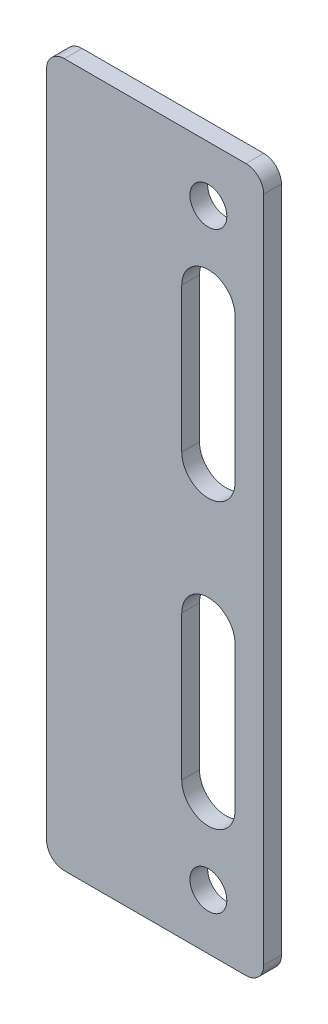
ISO-10303-21;
HEADER;
FILE_DESCRIPTION(('STEP AP214'),'2;1');
FILE_NAME('part.step','',(''),(''),'','','');
FILE_SCHEMA(('AUTOMOTIVE_DESIGN { 1 0 10303 214 1 1 1 1 }'));
ENDSEC;
DATA;
#1=APPLICATION_CONTEXT('core data for automotive mechanical design processes');
#2=APPLICATION_PROTOCOL_DEFINITION('international standard','automotive_design',2000,#1);
#3=PRODUCT_CONTEXT('',#1,'mechanical');
#4=PRODUCT('Part','Part','',(#3));
#5=PRODUCT_RELATED_PRODUCT_CATEGORY('part','',(#4));
#6=PRODUCT_DEFINITION_FORMATION('','',#4);
#7=PRODUCT_DEFINITION_CONTEXT('part definition',#1,'design');
#8=PRODUCT_DEFINITION('design','',#6,#7);
#9=PRODUCT_DEFINITION_SHAPE('','',#8);
#10=(LENGTH_UNIT() NAMED_UNIT(*) SI_UNIT(.MILLI.,.METRE.));
#11=(NAMED_UNIT(*) PLANE_ANGLE_UNIT() SI_UNIT($,.RADIAN.));
#12=(NAMED_UNIT(*) SI_UNIT($,.STERADIAN.) SOLID_ANGLE_UNIT());
#13=UNCERTAINTY_MEASURE_WITH_UNIT(LENGTH_MEASURE(1.E-05),#10,'distance_accuracy_value','');
#14=(GEOMETRIC_REPRESENTATION_CONTEXT(3) GLOBAL_UNCERTAINTY_ASSIGNED_CONTEXT((#13)) GLOBAL_UNIT_ASSIGNED_CONTEXT((#10,
#11,#12)) REPRESENTATION_CONTEXT('',''));
#15=CARTESIAN_POINT('',(0.,0.,0.));
#16=DIRECTION('',(0.,0.,1.));
#17=DIRECTION('',(1.,0.,0.));
#18=AXIS2_PLACEMENT_3D('',#15,#16,#17);
#19=CARTESIAN_POINT('',(4.71844785465692E-13,62.9000000569999,3.17500000000022));
#20=DIRECTION('',(0.,-1.,0.));
#21=DIRECTION('',(1.,0.,0.));
#22=AXIS2_PLACEMENT_3D('',#19,#20,#21);
#23=PLANE('',#22);
#24=DIRECTION('',(-1.,0.,0.));
#25=VECTOR('',#24,1.);
#26=CARTESIAN_POINT('',(4.71844785465692E-13,62.9000000569999,2.22044604925031E-13));
#27=LINE('',#26,#25);
#28=CARTESIAN_POINT('',(6.72500001200115,62.9000000569999,2.20924667446942E-13));
#29=VERTEX_POINT('',#28);
#30=CARTESIAN_POINT('',(-25.7750000119999,62.9000000569999,2.26337004695987E-13));
#31=VERTEX_POINT('',#30);
#32=EDGE_CURVE('E233',#29,#31,#27,.T.);
#33=ORIENTED_EDGE('',*,*,#32,.T.);
#34=DIRECTION('',(0.,0.,-1.));
#35=VECTOR('',#34,1.);
#36=CARTESIAN_POINT('',(-25.7750000119999,62.9000000569999,3.17500000000022));
#37=LINE('',#36,#35);
#38=CARTESIAN_POINT('',(-25.7750000119999,62.9000000569999,3.17500000000023));
#39=VERTEX_POINT('',#38);
#40=EDGE_CURVE('E285',#31,#39,#37,.F.);
#41=ORIENTED_EDGE('',*,*,#40,.T.);
#42=DIRECTION('',(-1.,0.,0.));
#43=VECTOR('',#42,1.);
#44=CARTESIAN_POINT('',(4.71844785465692E-13,62.9000000569999,3.17500000000022));
#45=LINE('',#44,#43);
#46=CARTESIAN_POINT('',(6.72500001200115,62.9000000569999,3.17500000000022));
#47=VERTEX_POINT('',#46);
#48=EDGE_CURVE('E215',#47,#39,#45,.T.);
#49=ORIENTED_EDGE('',*,*,#48,.F.);
#50=DIRECTION('',(0.,0.,-1.));
#51=VECTOR('',#50,1.);
#52=CARTESIAN_POINT('',(6.72500001200115,62.9000000569999,3.17500000000022));
#53=LINE('',#52,#51);
#54=EDGE_CURVE('E282',#47,#29,#53,.T.);
#55=ORIENTED_EDGE('',*,*,#54,.T.);
#56=EDGE_LOOP('',(#33,#41,#49,#55));
#57=FACE_BOUND('',#56,.T.);
#58=ADVANCED_FACE('F34',(#57),#23,.F.);
#59=CARTESIAN_POINT('',(-28.950000012,0.,3.175));
#60=DIRECTION('',(1.,0.,0.));
#61=DIRECTION('',(0.,1.,0.));
#62=AXIS2_PLACEMENT_3D('',#59,#60,#61);
#63=PLANE('',#62);
#64=DIRECTION('',(0.,-1.00000000000001,0.));
#65=VECTOR('',#64,1.);
#66=CARTESIAN_POINT('',(-28.950000012,0.,0.));
#67=LINE('',#66,#65);
#68=CARTESIAN_POINT('',(-28.9500000119999,59.7250000570012,-2.20474333444994E-13));
#69=VERTEX_POINT('',#68);
#70=CARTESIAN_POINT('',(-28.950000012,-59.7250000570058,2.20474333445011E-13));
#71=VERTEX_POINT('',#70);
#72=EDGE_CURVE('E236',#69,#71,#67,.T.);
#73=ORIENTED_EDGE('',*,*,#72,.T.);
#74=DIRECTION('',(0.,0.,-1.));
#75=VECTOR('',#74,1.);
#76=CARTESIAN_POINT('',(-28.950000012,-59.7250000570045,3.17500000000289));
#77=LINE('',#76,#75);
#78=CARTESIAN_POINT('',(-28.950000012,-59.7250000570058,3.17500000000022));
#79=VERTEX_POINT('',#78);
#80=EDGE_CURVE('E273',#71,#79,#77,.F.);
#81=ORIENTED_EDGE('',*,*,#80,.T.);
#82=DIRECTION('',(0.,-1.00000000000001,0.));
#83=VECTOR('',#82,1.);
#84=CARTESIAN_POINT('',(-28.950000012,0.,3.175));
#85=LINE('',#84,#83);
#86=CARTESIAN_POINT('',(-28.9500000119999,59.7250000570012,3.17499999999978));
#87=VERTEX_POINT('',#86);
#88=EDGE_CURVE('E218',#87,#79,#85,.T.);
#89=ORIENTED_EDGE('',*,*,#88,.F.);
#90=DIRECTION('',(0.,0.,-1.));
#91=VECTOR('',#90,1.);
#92=CARTESIAN_POINT('',(-28.9500000119999,59.7250000569999,3.175));
#93=LINE('',#92,#91);
#94=EDGE_CURVE('E270',#87,#69,#93,.T.);
#95=ORIENTED_EDGE('',*,*,#94,.T.);
#96=EDGE_LOOP('',(#73,#81,#89,#95));
#97=FACE_BOUND('',#96,.T.);
#98=ADVANCED_FACE('F300',(#97),#63,.F.);
#99=CARTESIAN_POINT('',(3.85802501057242E-12,-62.9000000570045,3.17500000000555));
#100=DIRECTION('',(0.,-1.,0.));
#101=DIRECTION('',(1.,0.,0.));
#102=AXIS2_PLACEMENT_3D('',#99,#100,#101);
#103=PLANE('',#102);
#104=DIRECTION('',(-1.,0.,0.));
#105=VECTOR('',#104,1.);
#106=CARTESIAN_POINT('',(3.85802501057242E-12,-62.9000000570045,3.17500000000555));
#107=LINE('',#106,#105);
#108=CARTESIAN_POINT('',(6.7250000120008,-62.9000000570045,3.17500000000555));
#109=VERTEX_POINT('',#108);
#110=CARTESIAN_POINT('',(-25.775000012,-62.9000000570045,3.17500000000556));
#111=VERTEX_POINT('',#110);
#112=EDGE_CURVE('E221',#109,#111,#107,.T.);
#113=ORIENTED_EDGE('',*,*,#112,.T.);
#114=DIRECTION('',(0.,0.,-1.));
#115=VECTOR('',#114,1.);
#116=CARTESIAN_POINT('',(-25.775000012,-62.9000000570045,2.88657986402541E-12));
#117=LINE('',#116,#115);
#118=CARTESIAN_POINT('',(-25.775000012,-62.9000000570045,5.55540752289674E-12));
#119=VERTEX_POINT('',#118);
#120=EDGE_CURVE('E259',#111,#119,#117,.T.);
#121=ORIENTED_EDGE('',*,*,#120,.T.);
#122=DIRECTION('',(-1.,0.,0.));
#123=VECTOR('',#122,1.);
#124=CARTESIAN_POINT('',(3.85802501057242E-12,-62.9000000570045,5.55111512312578E-12));
#125=LINE('',#124,#123);
#126=CARTESIAN_POINT('',(6.7250000120008,-62.9000000570045,5.54999518564769E-12));
#127=VERTEX_POINT('',#126);
#128=EDGE_CURVE('E239',#127,#119,#125,.T.);
#129=ORIENTED_EDGE('',*,*,#128,.F.);
#130=DIRECTION('',(0.,0.,-1.));
#131=VECTOR('',#130,1.);
#132=CARTESIAN_POINT('',(6.7250000120008,-62.9000000570045,3.1750000000025));
#133=LINE('',#132,#131);
#134=EDGE_CURVE('E226',#127,#109,#133,.F.);
#135=ORIENTED_EDGE('',*,*,#134,.T.);
#136=EDGE_LOOP('',(#113,#121,#129,#135));
#137=FACE_BOUND('',#136,.T.);
#138=ADVANCED_FACE('F309',(#137),#103,.T.);
#139=CARTESIAN_POINT('',(4.19109191795997E-12,-53.0000000450045,3.17500000000444));
#140=DIRECTION('',(0.,0.,-1.));
#141=DIRECTION('',(-1.,0.,0.));
#142=AXIS2_PLACEMENT_3D('',#139,#140,#141);
#143=CYLINDRICAL_SURFACE('',#142,3.3);
#144=CARTESIAN_POINT('',(4.19109191795997E-12,-53.0000000450045,3.17500000000444));
#145=DIRECTION('',(0.,0.,1.00000000000004));
#146=DIRECTION('',(1.,0.,0.));
#147=AXIS2_PLACEMENT_3D('',#144,#145,#146);
#148=CIRCLE('',#147,3.3);
#149=CARTESIAN_POINT('',(3.30000000000419,-53.0000000450045,3.17500000000444));
#150=VERTEX_POINT('',#149);
#151=EDGE_CURVE('E211',#150,#150,#148,.T.);
#152=ORIENTED_EDGE('',*,*,#151,.T.);
#153=EDGE_LOOP('',(#152));
#154=FACE_BOUND('',#153,.T.);
#155=CARTESIAN_POINT('',(4.19109191795997E-12,-53.0000000450045,4.44089209850063E-12));
#156=DIRECTION('',(0.,0.,1.00000000000004));
#157=DIRECTION('',(1.,0.,0.));
#158=AXIS2_PLACEMENT_3D('',#155,#156,#157);
#159=CIRCLE('',#158,3.3);
#160=CARTESIAN_POINT('',(3.30000000000419,-53.0000000450045,4.44034253810344E-12));
#161=VERTEX_POINT('',#160);
#162=EDGE_CURVE('E230',#161,#161,#159,.T.);
#163=ORIENTED_EDGE('',*,*,#162,.F.);
#164=EDGE_LOOP('',(#163));
#165=FACE_BOUND('',#164,.T.);
#166=ADVANCED_FACE('F329',(#154,#165),#143,.F.);
#167=CARTESIAN_POINT('',(5.27355936696949E-13,53.0000000449997,3.17500000000067));
#168=DIRECTION('',(0.,0.,-1.));
#169=DIRECTION('',(-1.,0.,0.));
#170=AXIS2_PLACEMENT_3D('',#167,#168,#169);
#171=CYLINDRICAL_SURFACE('',#170,3.3);
#172=CARTESIAN_POINT('',(5.27355936696949E-13,53.0000000449997,3.17500000000067));
#173=DIRECTION('',(0.,0.,1.00000000000004));
#174=DIRECTION('',(1.,0.,0.));
#175=AXIS2_PLACEMENT_3D('',#172,#173,#174);
#176=CIRCLE('',#175,3.3);
#177=CARTESIAN_POINT('',(3.30000000000053,53.0000000449997,3.17500000000067));
#178=VERTEX_POINT('',#177);
#179=EDGE_CURVE('E208',#178,#178,#176,.T.);
#180=ORIENTED_EDGE('',*,*,#179,.T.);
#181=EDGE_LOOP('',(#180));
#182=FACE_BOUND('',#181,.T.);
#183=CARTESIAN_POINT('',(5.27355936696949E-13,53.0000000449997,6.66133814775094E-13));
#184=DIRECTION('',(0.,0.,1.00000000000004));
#185=DIRECTION('',(1.,0.,0.));
#186=AXIS2_PLACEMENT_3D('',#183,#184,#185);
#187=CIRCLE('',#186,3.3);
#188=CARTESIAN_POINT('',(3.30000000000053,53.0000000449997,6.65584254377904E-13));
#189=VERTEX_POINT('',#188);
#190=EDGE_CURVE('E227',#189,#189,#187,.T.);
#191=ORIENTED_EDGE('',*,*,#190,.F.);
#192=EDGE_LOOP('',(#191));
#193=FACE_BOUND('',#192,.T.);
#194=ADVANCED_FACE('F332',(#182,#193),#171,.F.);
#195=CARTESIAN_POINT('',(9.90000001200098,-1.346145417358E-12,3.17500000000278));
#196=DIRECTION('',(-1.,0.,0.));
#197=DIRECTION('',(0.,-1.,0.));
#198=AXIS2_PLACEMENT_3D('',#195,#196,#197);
#199=PLANE('',#198);
#200=DIRECTION('',(0.,1.00000000000003,0.));
#201=VECTOR('',#200,1.);
#202=CARTESIAN_POINT('',(9.90000001200098,-1.346145417358E-12,3.17500000000278));
#203=LINE('',#202,#201);
#204=CARTESIAN_POINT('',(9.9000000120008,-59.7250000570075,3.17500000000325));
#205=VERTEX_POINT('',#204);
#206=CARTESIAN_POINT('',(9.90000001200115,59.7250000570029,3.1750000000023));
#207=VERTEX_POINT('',#206);
#208=EDGE_CURVE('E224',#205,#207,#203,.T.);
#209=ORIENTED_EDGE('',*,*,#208,.F.);
#210=DIRECTION('',(0.,0.,-1.));
#211=VECTOR('',#210,1.);
#212=CARTESIAN_POINT('',(9.9000000120008,-59.7250000570045,2.4980018054066E-12));
#213=LINE('',#212,#211);
#214=CARTESIAN_POINT('',(9.9000000120008,-59.7250000570075,3.25131796531265E-12));
#215=VERTEX_POINT('',#214);
#216=EDGE_CURVE('E11',#205,#215,#213,.T.);
#217=ORIENTED_EDGE('',*,*,#216,.T.);
#218=DIRECTION('',(0.,1.00000000000003,0.));
#219=VECTOR('',#218,1.);
#220=CARTESIAN_POINT('',(9.90000001200098,-1.346145417358E-12,2.77555756156289E-12));
#221=LINE('',#220,#219);
#222=CARTESIAN_POINT('',(9.90000001200115,59.7250000570029,2.29979715781315E-12));
#223=VERTEX_POINT('',#222);
#224=EDGE_CURVE('E212',#215,#223,#221,.T.);
#225=ORIENTED_EDGE('',*,*,#224,.T.);
#226=DIRECTION('',(0.,0.,-1.));
#227=VECTOR('',#226,1.);
#228=CARTESIAN_POINT('',(9.90000001200115,59.7250000569999,3.17500000000278));
#229=LINE('',#228,#227);
#230=EDGE_CURVE('E42',#223,#207,#229,.F.);
#231=ORIENTED_EDGE('',*,*,#230,.T.);
#232=EDGE_LOOP('',(#209,#217,#225,#231));
#233=FACE_BOUND('',#232,.T.);
#234=ADVANCED_FACE('F315',(#233),#199,.F.);
#235=CARTESIAN_POINT('',(0.,0.,3.175));
#236=DIRECTION('',(0.,0.,1.00000000000004));
#237=DIRECTION('',(1.,0.,0.));
#238=AXIS2_PLACEMENT_3D('',#235,#236,#237);
#239=PLANE('',#238);
#240=CARTESIAN_POINT('',(0.,38.337500033,3.17500000000026));
#241=DIRECTION('',(0.,0.,1.));
#242=DIRECTION('',(1.,0.,0.));
#243=AXIS2_PLACEMENT_3D('',#240,#241,#242);
#244=CIRCLE('',#243,4.7625);
#245=CARTESIAN_POINT('',(4.7625,38.337500033,3.17500000000017));
#246=VERTEX_POINT('',#245);
#247=CARTESIAN_POINT('',(-4.7625,38.337500033,3.17500000000027));
#248=VERTEX_POINT('',#247);
#249=EDGE_CURVE('E156',#246,#248,#244,.T.);
#250=ORIENTED_EDGE('',*,*,#249,.F.);
#251=DIRECTION('',(0.,1.,0.));
#252=VECTOR('',#251,1.);
#253=CARTESIAN_POINT('',(4.7625,38.337500033,3.17500000000008));
#254=LINE('',#253,#252);
#255=CARTESIAN_POINT('',(4.7625,12.462499967,3.17500000000009));
#256=VERTEX_POINT('',#255);
#257=EDGE_CURVE('E255',#256,#246,#254,.T.);
#258=ORIENTED_EDGE('',*,*,#257,.F.);
#259=CARTESIAN_POINT('',(0.,12.462499967,3.17500000000009));
#260=DIRECTION('',(0.,0.,1.));
#261=DIRECTION('',(1.,0.,0.));
#262=AXIS2_PLACEMENT_3D('',#259,#260,#261);
#263=CIRCLE('',#262,4.7625);
#264=CARTESIAN_POINT('',(-4.7625,12.462499967,3.17500000000018));
#265=VERTEX_POINT('',#264);
#266=EDGE_CURVE('E253',#265,#256,#263,.T.);
#267=ORIENTED_EDGE('',*,*,#266,.F.);
#268=DIRECTION('',(0.,1.,0.));
#269=VECTOR('',#268,1.);
#270=CARTESIAN_POINT('',(-4.7625,38.337500033,3.17500000000027));
#271=LINE('',#270,#269);
#272=EDGE_CURVE('E251',#248,#265,#271,.F.);
#273=ORIENTED_EDGE('',*,*,#272,.F.);
#274=EDGE_LOOP('',(#250,#258,#267,#273));
#275=FACE_BOUND('',#274,.T.);
#276=CARTESIAN_POINT('',(0.,-12.462499967,3.17499999999991));
#277=DIRECTION('',(0.,0.,1.));
#278=DIRECTION('',(1.,0.,0.));
#279=AXIS2_PLACEMENT_3D('',#276,#277,#278);
#280=CIRCLE('',#279,4.76249999999999);
#281=CARTESIAN_POINT('',(4.76249999999999,-12.462499967,3.17499999999982));
#282=VERTEX_POINT('',#281);
#283=CARTESIAN_POINT('',(-4.7625,-12.462499967,3.17499999999991));
#284=VERTEX_POINT('',#283);
#285=EDGE_CURVE('E248',#282,#284,#280,.T.);
#286=ORIENTED_EDGE('',*,*,#285,.F.);
#287=DIRECTION('',(0.,1.,0.));
#288=VECTOR('',#287,1.);
#289=CARTESIAN_POINT('',(4.76249999999999,-12.462499967,3.17499999999973));
#290=LINE('',#289,#288);
#291=CARTESIAN_POINT('',(4.7625,-38.337500033,3.17499999999973));
#292=VERTEX_POINT('',#291);
#293=EDGE_CURVE('E246',#292,#282,#290,.T.);
#294=ORIENTED_EDGE('',*,*,#293,.F.);
#295=CARTESIAN_POINT('',(0.,-38.337500033,3.17499999999974));
#296=DIRECTION('',(0.,0.,1.));
#297=DIRECTION('',(1.,0.,0.));
#298=AXIS2_PLACEMENT_3D('',#295,#296,#297);
#299=CIRCLE('',#298,4.76249999999999);
#300=CARTESIAN_POINT('',(-4.76249999999999,-38.337500033,3.17499999999983));
#301=VERTEX_POINT('',#300);
#302=EDGE_CURVE('E244',#301,#292,#299,.T.);
#303=ORIENTED_EDGE('',*,*,#302,.F.);
#304=DIRECTION('',(0.,-1.,0.));
#305=VECTOR('',#304,1.);
#306=CARTESIAN_POINT('',(-4.7625,-12.462499967,3.17499999999992));
#307=LINE('',#306,#305);
#308=EDGE_CURVE('E186',#284,#301,#307,.T.);
#309=ORIENTED_EDGE('',*,*,#308,.F.);
#310=EDGE_LOOP('',(#286,#294,#303,#309));
#311=FACE_BOUND('',#310,.T.);
#312=ORIENTED_EDGE('',*,*,#179,.F.);
#313=EDGE_LOOP('',(#312));
#314=FACE_BOUND('',#313,.T.);
#315=ORIENTED_EDGE('',*,*,#151,.F.);
#316=EDGE_LOOP('',(#315));
#317=FACE_BOUND('',#316,.T.);
#318=ORIENTED_EDGE('',*,*,#88,.T.);
#319=CARTESIAN_POINT('',(-25.775000012,-59.7250000570045,3.17499999999961));
#320=DIRECTION('',(0.,0.,1.00000000000004));
#321=DIRECTION('',(0.,-1.,0.));
#322=AXIS2_PLACEMENT_3D('',#319,#320,#321);
#323=CIRCLE('',#322,3.175);
#324=EDGE_CURVE('E280',#79,#111,#323,.T.);
#325=ORIENTED_EDGE('',*,*,#324,.T.);
#326=ORIENTED_EDGE('',*,*,#112,.F.);
#327=CARTESIAN_POINT('',(6.7250000120008,-59.7250000570045,3.17499999999957));
#328=DIRECTION('',(0.,0.,1.00000000000004));
#329=DIRECTION('',(0.,-1.,0.));
#330=AXIS2_PLACEMENT_3D('',#327,#328,#329);
#331=CIRCLE('',#330,3.175);
#332=EDGE_CURVE('E55',#109,#205,#331,.T.);
#333=ORIENTED_EDGE('',*,*,#332,.T.);
#334=ORIENTED_EDGE('',*,*,#208,.T.);
#335=CARTESIAN_POINT('',(6.72500001200115,59.7250000569999,3.17500000000041));
#336=DIRECTION('',(0.,0.,1.00000000000004));
#337=DIRECTION('',(0.,-1.,0.));
#338=AXIS2_PLACEMENT_3D('',#335,#336,#337);
#339=CIRCLE('',#338,3.175);
#340=EDGE_CURVE('E275',#207,#47,#339,.T.);
#341=ORIENTED_EDGE('',*,*,#340,.T.);
#342=ORIENTED_EDGE('',*,*,#48,.T.);
#343=CARTESIAN_POINT('',(-25.7750000119999,59.7250000569999,3.17500000000045));
#344=DIRECTION('',(0.,0.,1.00000000000004));
#345=DIRECTION('',(0.,-1.,0.));
#346=AXIS2_PLACEMENT_3D('',#343,#344,#345);
#347=CIRCLE('',#346,3.175);
#348=EDGE_CURVE('E278',#39,#87,#347,.T.);
#349=ORIENTED_EDGE('',*,*,#348,.T.);
#350=EDGE_LOOP('',(#318,#325,#326,#333,#334,#341,#342,#349));
#351=FACE_BOUND('',#350,.T.);
#352=ADVANCED_FACE('F293',(#275,#311,#314,#317,#351),#239,.T.);
#353=CARTESIAN_POINT('',(0.,0.,0.));
#354=DIRECTION('',(0.,0.,1.00000000000004));
#355=DIRECTION('',(1.,0.,0.));
#356=AXIS2_PLACEMENT_3D('',#353,#354,#355);
#357=PLANE('',#356);
#358=DIRECTION('',(0.,1.,0.));
#359=VECTOR('',#358,1.);
#360=CARTESIAN_POINT('',(4.7625,38.337500033,0.));
#361=LINE('',#360,#359);
#362=CARTESIAN_POINT('',(4.7625,12.462499967,0.));
#363=VERTEX_POINT('',#362);
#364=CARTESIAN_POINT('',(4.7625,38.337500033,0.));
#365=VERTEX_POINT('',#364);
#366=EDGE_CURVE('E160',#363,#365,#361,.T.);
#367=ORIENTED_EDGE('',*,*,#366,.T.);
#368=CARTESIAN_POINT('',(0.,38.337500033,0.));
#369=DIRECTION('',(0.,0.,1.));
#370=DIRECTION('',(1.,0.,0.));
#371=AXIS2_PLACEMENT_3D('',#368,#369,#370);
#372=CIRCLE('',#371,4.7625);
#373=CARTESIAN_POINT('',(-4.7625,38.337500033,0.));
#374=VERTEX_POINT('',#373);
#375=EDGE_CURVE('E153',#365,#374,#372,.T.);
#376=ORIENTED_EDGE('',*,*,#375,.T.);
#377=DIRECTION('',(0.,-1.,0.));
#378=VECTOR('',#377,1.);
#379=CARTESIAN_POINT('',(-4.7625,38.337500033,0.));
#380=LINE('',#379,#378);
#381=CARTESIAN_POINT('',(-4.7625,12.462499967,0.));
#382=VERTEX_POINT('',#381);
#383=EDGE_CURVE('E164',#374,#382,#380,.T.);
#384=ORIENTED_EDGE('',*,*,#383,.T.);
#385=CARTESIAN_POINT('',(0.,12.462499967,0.));
#386=DIRECTION('',(0.,0.,1.));
#387=DIRECTION('',(1.,0.,0.));
#388=AXIS2_PLACEMENT_3D('',#385,#386,#387);
#389=CIRCLE('',#388,4.7625);
#390=EDGE_CURVE('E169',#382,#363,#389,.T.);
#391=ORIENTED_EDGE('',*,*,#390,.T.);
#392=EDGE_LOOP('',(#367,#376,#384,#391));
#393=FACE_BOUND('',#392,.T.);
#394=DIRECTION('',(0.,1.,0.));
#395=VECTOR('',#394,1.);
#396=CARTESIAN_POINT('',(4.76249999999999,-12.462499967,0.));
#397=LINE('',#396,#395);
#398=CARTESIAN_POINT('',(4.7625,-38.337500033,0.));
#399=VERTEX_POINT('',#398);
#400=CARTESIAN_POINT('',(4.76249999999999,-12.462499967,0.));
#401=VERTEX_POINT('',#400);
#402=EDGE_CURVE('E198',#399,#401,#397,.T.);
#403=ORIENTED_EDGE('',*,*,#402,.T.);
#404=CARTESIAN_POINT('',(0.,-12.462499967,0.));
#405=DIRECTION('',(0.,0.,1.));
#406=DIRECTION('',(1.,0.,0.));
#407=AXIS2_PLACEMENT_3D('',#404,#405,#406);
#408=CIRCLE('',#407,4.76249999999999);
#409=CARTESIAN_POINT('',(-4.7625,-12.462499967,0.));
#410=VERTEX_POINT('',#409);
#411=EDGE_CURVE('E189',#401,#410,#408,.T.);
#412=ORIENTED_EDGE('',*,*,#411,.T.);
#413=DIRECTION('',(0.,-1.,0.));
#414=VECTOR('',#413,1.);
#415=CARTESIAN_POINT('',(-4.7625,-12.462499967,0.));
#416=LINE('',#415,#414);
#417=CARTESIAN_POINT('',(-4.76249999999999,-38.337500033,-2.62464009090792E-13));
#418=VERTEX_POINT('',#417);
#419=EDGE_CURVE('E192',#410,#418,#416,.T.);
#420=ORIENTED_EDGE('',*,*,#419,.T.);
#421=CARTESIAN_POINT('',(0.,-38.337500033,0.));
#422=DIRECTION('',(0.,0.,1.));
#423=DIRECTION('',(1.,0.,0.));
#424=AXIS2_PLACEMENT_3D('',#421,#422,#423);
#425=CIRCLE('',#424,4.76249999999999);
#426=EDGE_CURVE('E195',#418,#399,#425,.T.);
#427=ORIENTED_EDGE('',*,*,#426,.T.);
#428=EDGE_LOOP('',(#403,#412,#420,#427));
#429=FACE_BOUND('',#428,.T.);
#430=ORIENTED_EDGE('',*,*,#190,.T.);
#431=EDGE_LOOP('',(#430));
#432=FACE_BOUND('',#431,.T.);
#433=ORIENTED_EDGE('',*,*,#162,.T.);
#434=EDGE_LOOP('',(#433));
#435=FACE_BOUND('',#434,.T.);
#436=ORIENTED_EDGE('',*,*,#128,.T.);
#437=CARTESIAN_POINT('',(-25.775000012,-59.7250000570045,-3.86843335142828E-13));
#438=DIRECTION('',(0.,0.,1.00000000000004));
#439=DIRECTION('',(0.,-1.,0.));
#440=AXIS2_PLACEMENT_3D('',#437,#438,#439);
#441=CIRCLE('',#440,3.175);
#442=EDGE_CURVE('E268',#119,#71,#441,.F.);
#443=ORIENTED_EDGE('',*,*,#442,.T.);
#444=ORIENTED_EDGE('',*,*,#72,.F.);
#445=CARTESIAN_POINT('',(-25.7750000119999,59.7250000569999,4.48426018540005E-13));
#446=DIRECTION('',(0.,0.,1.00000000000004));
#447=DIRECTION('',(0.,-1.,0.));
#448=AXIS2_PLACEMENT_3D('',#445,#446,#447);
#449=CIRCLE('',#448,3.175);
#450=EDGE_CURVE('E266',#69,#31,#449,.F.);
#451=ORIENTED_EDGE('',*,*,#450,.T.);
#452=ORIENTED_EDGE('',*,*,#32,.F.);
#453=CARTESIAN_POINT('',(6.72500001200115,59.7250000569999,4.09828421199521E-13));
#454=DIRECTION('',(0.,0.,1.00000000000004));
#455=DIRECTION('',(0.,-1.,0.));
#456=AXIS2_PLACEMENT_3D('',#453,#454,#455);
#457=CIRCLE('',#456,3.175);
#458=EDGE_CURVE('E262',#29,#223,#457,.F.);
#459=ORIENTED_EDGE('',*,*,#458,.T.);
#460=ORIENTED_EDGE('',*,*,#224,.F.);
#461=CARTESIAN_POINT('',(6.7250000120008,-59.7250000570045,-4.25874613352306E-13));
#462=DIRECTION('',(0.,0.,1.00000000000004));
#463=DIRECTION('',(0.,-1.,0.));
#464=AXIS2_PLACEMENT_3D('',#461,#462,#463);
#465=CIRCLE('',#464,3.175);
#466=EDGE_CURVE('E264',#215,#127,#465,.F.);
#467=ORIENTED_EDGE('',*,*,#466,.T.);
#468=EDGE_LOOP('',(#436,#443,#444,#451,#452,#459,#460,#467));
#469=FACE_BOUND('',#468,.T.);
#470=ADVANCED_FACE('F171',(#393,#429,#432,#435,#469),#357,.F.);
#471=CARTESIAN_POINT('',(0.,-12.462499967,0.));
#472=DIRECTION('',(0.,0.,1.));
#473=DIRECTION('',(1.,0.,0.));
#474=AXIS2_PLACEMENT_3D('',#471,#472,#473);
#475=CYLINDRICAL_SURFACE('',#474,4.76249999999999);
#476=ORIENTED_EDGE('',*,*,#285,.T.);
#477=DIRECTION('',(0.,0.,1.));
#478=VECTOR('',#477,1.);
#479=CARTESIAN_POINT('',(-4.7625,-12.462499967,0.));
#480=LINE('',#479,#478);
#481=EDGE_CURVE('E201',#410,#284,#480,.T.);
#482=ORIENTED_EDGE('',*,*,#481,.F.);
#483=ORIENTED_EDGE('',*,*,#411,.F.);
#484=DIRECTION('',(0.,0.,1.));
#485=VECTOR('',#484,1.);
#486=CARTESIAN_POINT('',(4.76249999999999,-12.462499967,0.));
#487=LINE('',#486,#485);
#488=EDGE_CURVE('E174',#401,#282,#487,.T.);
#489=ORIENTED_EDGE('',*,*,#488,.T.);
#490=EDGE_LOOP('',(#476,#482,#483,#489));
#491=FACE_BOUND('',#490,.T.);
#492=ADVANCED_FACE('F420',(#491),#475,.F.);
#493=CARTESIAN_POINT('',(4.76249999999999,-12.462499967,0.));
#494=DIRECTION('',(1.,0.,0.));
#495=DIRECTION('',(0.,1.,0.));
#496=AXIS2_PLACEMENT_3D('',#493,#494,#495);
#497=PLANE('',#496);
#498=ORIENTED_EDGE('',*,*,#293,.T.);
#499=ORIENTED_EDGE('',*,*,#488,.F.);
#500=ORIENTED_EDGE('',*,*,#402,.F.);
#501=DIRECTION('',(0.,0.,1.));
#502=VECTOR('',#501,1.);
#503=CARTESIAN_POINT('',(4.7625,-38.337500033,0.));
#504=LINE('',#503,#502);
#505=EDGE_CURVE('E177',#399,#292,#504,.T.);
#506=ORIENTED_EDGE('',*,*,#505,.T.);
#507=EDGE_LOOP('',(#498,#499,#500,#506));
#508=FACE_BOUND('',#507,.T.);
#509=ADVANCED_FACE('F411',(#508),#497,.F.);
#510=CARTESIAN_POINT('',(0.,-38.337500033,0.));
#511=DIRECTION('',(0.,0.,1.));
#512=DIRECTION('',(1.,0.,0.));
#513=AXIS2_PLACEMENT_3D('',#510,#511,#512);
#514=CYLINDRICAL_SURFACE('',#513,4.76249999999999);
#515=ORIENTED_EDGE('',*,*,#302,.T.);
#516=ORIENTED_EDGE('',*,*,#505,.F.);
#517=ORIENTED_EDGE('',*,*,#426,.F.);
#518=DIRECTION('',(0.,0.,1.));
#519=VECTOR('',#518,1.);
#520=CARTESIAN_POINT('',(-4.76249999999999,-38.337500033,0.));
#521=LINE('',#520,#519);
#522=EDGE_CURVE('E203',#418,#301,#521,.T.);
#523=ORIENTED_EDGE('',*,*,#522,.T.);
#524=EDGE_LOOP('',(#515,#516,#517,#523));
#525=FACE_BOUND('',#524,.T.);
#526=ADVANCED_FACE('F402',(#525),#514,.F.);
#527=CARTESIAN_POINT('',(-4.7625,-12.462499967,0.));
#528=DIRECTION('',(-1.,0.,0.));
#529=DIRECTION('',(0.,-1.,0.));
#530=AXIS2_PLACEMENT_3D('',#527,#528,#529);
#531=PLANE('',#530);
#532=ORIENTED_EDGE('',*,*,#308,.T.);
#533=ORIENTED_EDGE('',*,*,#522,.F.);
#534=ORIENTED_EDGE('',*,*,#419,.F.);
#535=ORIENTED_EDGE('',*,*,#481,.T.);
#536=EDGE_LOOP('',(#532,#533,#534,#535));
#537=FACE_BOUND('',#536,.T.);
#538=ADVANCED_FACE('F394',(#537),#531,.F.);
#539=CARTESIAN_POINT('',(0.,38.337500033,0.));
#540=DIRECTION('',(0.,0.,1.));
#541=DIRECTION('',(1.,0.,0.));
#542=AXIS2_PLACEMENT_3D('',#539,#540,#541);
#543=CYLINDRICAL_SURFACE('',#542,4.7625);
#544=ORIENTED_EDGE('',*,*,#249,.T.);
#545=DIRECTION('',(0.,0.,1.));
#546=VECTOR('',#545,1.);
#547=CARTESIAN_POINT('',(-4.7625,38.337500033,0.));
#548=LINE('',#547,#546);
#549=EDGE_CURVE('E148',#374,#248,#548,.T.);
#550=ORIENTED_EDGE('',*,*,#549,.F.);
#551=ORIENTED_EDGE('',*,*,#375,.F.);
#552=DIRECTION('',(0.,0.,1.));
#553=VECTOR('',#552,1.);
#554=CARTESIAN_POINT('',(4.7625,38.337500033,0.));
#555=LINE('',#554,#553);
#556=EDGE_CURVE('E185',#365,#246,#555,.T.);
#557=ORIENTED_EDGE('',*,*,#556,.T.);
#558=EDGE_LOOP('',(#544,#550,#551,#557));
#559=FACE_BOUND('',#558,.T.);
#560=ADVANCED_FACE('F150',(#559),#543,.F.);
#561=CARTESIAN_POINT('',(4.7625,38.337500033,0.));
#562=DIRECTION('',(1.,0.,0.));
#563=DIRECTION('',(0.,0.,-1.));
#564=AXIS2_PLACEMENT_3D('',#561,#562,#563);
#565=PLANE('',#564);
#566=ORIENTED_EDGE('',*,*,#257,.T.);
#567=ORIENTED_EDGE('',*,*,#556,.F.);
#568=ORIENTED_EDGE('',*,*,#366,.F.);
#569=DIRECTION('',(0.,0.,1.));
#570=VECTOR('',#569,1.);
#571=CARTESIAN_POINT('',(4.7625,12.462499967,0.));
#572=LINE('',#571,#570);
#573=EDGE_CURVE('E182',#363,#256,#572,.T.);
#574=ORIENTED_EDGE('',*,*,#573,.T.);
#575=EDGE_LOOP('',(#566,#567,#568,#574));
#576=FACE_BOUND('',#575,.T.);
#577=ADVANCED_FACE('F377',(#576),#565,.F.);
#578=CARTESIAN_POINT('',(0.,12.462499967,0.));
#579=DIRECTION('',(0.,0.,1.));
#580=DIRECTION('',(1.,0.,0.));
#581=AXIS2_PLACEMENT_3D('',#578,#579,#580);
#582=CYLINDRICAL_SURFACE('',#581,4.7625);
#583=ORIENTED_EDGE('',*,*,#266,.T.);
#584=ORIENTED_EDGE('',*,*,#573,.F.);
#585=ORIENTED_EDGE('',*,*,#390,.F.);
#586=DIRECTION('',(0.,0.,1.));
#587=VECTOR('',#586,1.);
#588=CARTESIAN_POINT('',(-4.7625,12.462499967,0.));
#589=LINE('',#588,#587);
#590=EDGE_CURVE('E159',#382,#265,#589,.T.);
#591=ORIENTED_EDGE('',*,*,#590,.T.);
#592=EDGE_LOOP('',(#583,#584,#585,#591));
#593=FACE_BOUND('',#592,.T.);
#594=ADVANCED_FACE('F369',(#593),#582,.F.);
#595=CARTESIAN_POINT('',(-4.7625,38.337500033,0.));
#596=DIRECTION('',(-1.,0.,0.));
#597=DIRECTION('',(0.,0.,1.));
#598=AXIS2_PLACEMENT_3D('',#595,#596,#597);
#599=PLANE('',#598);
#600=ORIENTED_EDGE('',*,*,#272,.T.);
#601=ORIENTED_EDGE('',*,*,#590,.F.);
#602=ORIENTED_EDGE('',*,*,#383,.F.);
#603=ORIENTED_EDGE('',*,*,#549,.T.);
#604=EDGE_LOOP('',(#600,#601,#602,#603));
#605=FACE_BOUND('',#604,.T.);
#606=ADVANCED_FACE('F165',(#605),#599,.F.);
#607=CARTESIAN_POINT('',(-25.775000012,-59.7250000570045,3.17500000000555));
#608=DIRECTION('',(0.,0.,1.));
#609=DIRECTION('',(1.,0.,0.));
#610=AXIS2_PLACEMENT_3D('',#607,#608,#609);
#611=CYLINDRICAL_SURFACE('',#610,3.175);
#612=ORIENTED_EDGE('',*,*,#324,.F.);
#613=ORIENTED_EDGE('',*,*,#80,.F.);
#614=ORIENTED_EDGE('',*,*,#442,.F.);
#615=ORIENTED_EDGE('',*,*,#120,.F.);
#616=EDGE_LOOP('',(#612,#613,#614,#615));
#617=FACE_BOUND('',#616,.T.);
#618=ADVANCED_FACE('F307',(#617),#611,.T.);
#619=CARTESIAN_POINT('',(-25.7750000119999,59.7250000569999,3.175));
#620=DIRECTION('',(0.,0.,-1.));
#621=DIRECTION('',(-1.,0.,0.));
#622=AXIS2_PLACEMENT_3D('',#619,#620,#621);
#623=CYLINDRICAL_SURFACE('',#622,3.175);
#624=ORIENTED_EDGE('',*,*,#348,.F.);
#625=ORIENTED_EDGE('',*,*,#40,.F.);
#626=ORIENTED_EDGE('',*,*,#450,.F.);
#627=ORIENTED_EDGE('',*,*,#94,.F.);
#628=EDGE_LOOP('',(#624,#625,#626,#627));
#629=FACE_BOUND('',#628,.T.);
#630=ADVANCED_FACE('F297',(#629),#623,.T.);
#631=CARTESIAN_POINT('',(6.7250000120008,-59.7250000570045,3.17500000000278));
#632=DIRECTION('',(0.,0.,1.));
#633=DIRECTION('',(1.,0.,0.));
#634=AXIS2_PLACEMENT_3D('',#631,#632,#633);
#635=CYLINDRICAL_SURFACE('',#634,3.175);
#636=ORIENTED_EDGE('',*,*,#332,.F.);
#637=ORIENTED_EDGE('',*,*,#134,.F.);
#638=ORIENTED_EDGE('',*,*,#466,.F.);
#639=ORIENTED_EDGE('',*,*,#216,.F.);
#640=EDGE_LOOP('',(#636,#637,#638,#639));
#641=FACE_BOUND('',#640,.T.);
#642=ADVANCED_FACE('F313',(#641),#635,.T.);
#643=CARTESIAN_POINT('',(6.72500001200115,59.7250000569999,3.17500000000022));
#644=DIRECTION('',(0.,0.,-1.));
#645=DIRECTION('',(-1.,0.,0.));
#646=AXIS2_PLACEMENT_3D('',#643,#644,#645);
#647=CYLINDRICAL_SURFACE('',#646,3.175);
#648=ORIENTED_EDGE('',*,*,#340,.F.);
#649=ORIENTED_EDGE('',*,*,#230,.F.);
#650=ORIENTED_EDGE('',*,*,#458,.F.);
#651=ORIENTED_EDGE('',*,*,#54,.F.);
#652=EDGE_LOOP('',(#648,#649,#650,#651));
#653=FACE_BOUND('',#652,.T.);
#654=ADVANCED_FACE('F36',(#653),#647,.T.);
#655=CLOSED_SHELL('',(#58,#98,#138,#166,#194,#234,#352,#470,#492,#509,#526,#538,#560,#577,#594,
#606,#618,#630,#642,#654));
#656=MANIFOLD_SOLID_BREP('B2',#655);
#657=ADVANCED_BREP_SHAPE_REPRESENTATION('',(#18,#656),#14);
#658=SHAPE_DEFINITION_REPRESENTATION(#9,#657);
ENDSEC;
END-ISO-10303-21;
